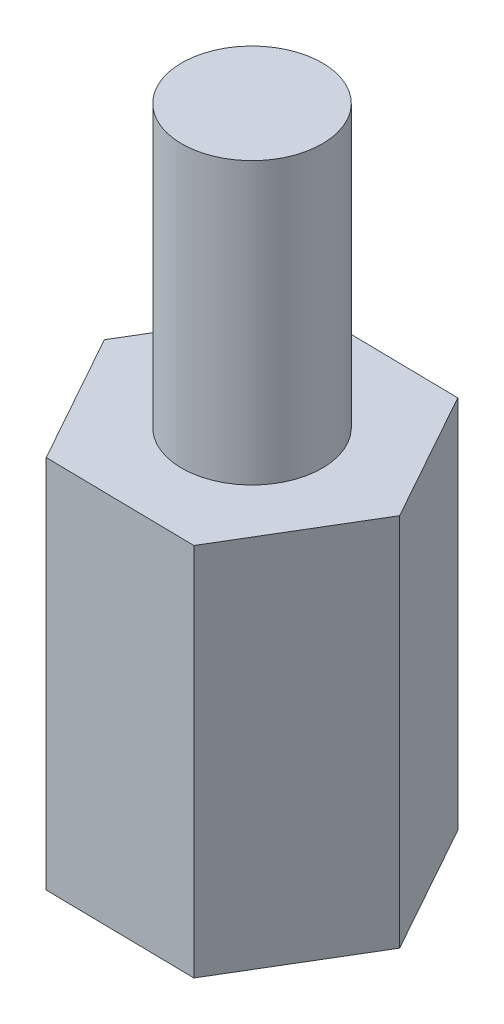
ISO-10303-21;
HEADER;
FILE_DESCRIPTION(('STEP AP214'),'2;1');
FILE_NAME('part.step','',(''),(''),'','','');
FILE_SCHEMA(('AUTOMOTIVE_DESIGN { 1 0 10303 214 1 1 1 1 }'));
ENDSEC;
DATA;
#1=APPLICATION_CONTEXT('core data for automotive mechanical design processes');
#2=APPLICATION_PROTOCOL_DEFINITION('international standard','automotive_design',2000,#1);
#3=PRODUCT_CONTEXT('',#1,'mechanical');
#4=PRODUCT('Part','Part','',(#3));
#5=PRODUCT_RELATED_PRODUCT_CATEGORY('part','',(#4));
#6=PRODUCT_DEFINITION_FORMATION('','',#4);
#7=PRODUCT_DEFINITION_CONTEXT('part definition',#1,'design');
#8=PRODUCT_DEFINITION('design','',#6,#7);
#9=PRODUCT_DEFINITION_SHAPE('','',#8);
#10=(LENGTH_UNIT() NAMED_UNIT(*) SI_UNIT(.MILLI.,.METRE.));
#11=(NAMED_UNIT(*) PLANE_ANGLE_UNIT() SI_UNIT($,.RADIAN.));
#12=(NAMED_UNIT(*) SI_UNIT($,.STERADIAN.) SOLID_ANGLE_UNIT());
#13=UNCERTAINTY_MEASURE_WITH_UNIT(LENGTH_MEASURE(1.E-05),#10,'distance_accuracy_value','');
#14=(GEOMETRIC_REPRESENTATION_CONTEXT(3) GLOBAL_UNCERTAINTY_ASSIGNED_CONTEXT((#13)) GLOBAL_UNIT_ASSIGNED_CONTEXT((#10,
#11,#12)) REPRESENTATION_CONTEXT('',''));
#15=CARTESIAN_POINT('',(0.,0.,0.));
#16=DIRECTION('',(0.,0.,1.));
#17=DIRECTION('',(1.,0.,0.));
#18=AXIS2_PLACEMENT_3D('',#15,#16,#17);
#19=CARTESIAN_POINT('',(-3.77710230661192,14.,-0.449026148338467));
#20=DIRECTION('',(0.,-1.,0.));
#21=DIRECTION('',(0.,0.,-1.));
#22=AXIS2_PLACEMENT_3D('',#19,#20,#21);
#23=CYLINDRICAL_SURFACE('',#22,1.5);
#24=CARTESIAN_POINT('',(-3.77710230661192,14.,-0.449026148338467));
#25=DIRECTION('',(0.,1.,0.));
#26=DIRECTION('',(0.,0.,1.));
#27=AXIS2_PLACEMENT_3D('',#24,#25,#26);
#28=CIRCLE('',#27,1.5);
#29=CARTESIAN_POINT('',(-3.77710230661192,14.,1.05097385166153));
#30=VERTEX_POINT('',#29);
#31=EDGE_CURVE('E11',#30,#30,#28,.T.);
#32=ORIENTED_EDGE('',*,*,#31,.F.);
#33=EDGE_LOOP('',(#32));
#34=FACE_BOUND('',#33,.T.);
#35=CARTESIAN_POINT('',(-3.77710230661192,8.,-0.449026148338467));
#36=DIRECTION('',(0.,1.,0.));
#37=DIRECTION('',(0.,0.,1.));
#38=AXIS2_PLACEMENT_3D('',#35,#36,#37);
#39=CIRCLE('',#38,1.5);
#40=CARTESIAN_POINT('',(-3.77710230661192,8.,1.05097385166153));
#41=VERTEX_POINT('',#40);
#42=EDGE_CURVE('E50',#41,#41,#39,.T.);
#43=ORIENTED_EDGE('',*,*,#42,.T.);
#44=EDGE_LOOP('',(#43));
#45=FACE_BOUND('',#44,.T.);
#46=ADVANCED_FACE('F47',(#34,#45),#23,.T.);
#47=CARTESIAN_POINT('',(-3.77710230661192,14.,-0.449026148338467));
#48=DIRECTION('',(0.,1.,0.));
#49=DIRECTION('',(0.,0.,1.));
#50=AXIS2_PLACEMENT_3D('',#47,#48,#49);
#51=PLANE('',#50);
#52=ORIENTED_EDGE('',*,*,#31,.T.);
#53=EDGE_LOOP('',(#52));
#54=FACE_BOUND('',#53,.T.);
#55=ADVANCED_FACE('F62',(#54),#51,.T.);
#56=CARTESIAN_POINT('',(-3.77710230661192,8.,-0.449026148338467));
#57=DIRECTION('',(0.,1.,0.));
#58=DIRECTION('',(0.,0.,1.));
#59=AXIS2_PLACEMENT_3D('',#56,#57,#58);
#60=PLANE('',#59);
#61=ORIENTED_EDGE('',*,*,#42,.F.);
#62=EDGE_LOOP('',(#61));
#63=FACE_BOUND('',#62,.T.);
#64=ADVANCED_FACE('F60',(#63),#60,.F.);
#65=CLOSED_SHELL('',(#46,#55,#64));
#66=MANIFOLD_SOLID_BREP('B2',#65);
#67=CARTESIAN_POINT('',(0.,8.,0.));
#68=DIRECTION('',(0.,1.,0.));
#69=DIRECTION('',(0.,0.,1.));
#70=AXIS2_PLACEMENT_3D('',#67,#68,#69);
#71=PLANE('',#70);
#72=DIRECTION('',(0.999876763326654,0.,0.0156989859358929));
#73=VECTOR('',#72,1.);
#74=CARTESIAN_POINT('',(-5.42261654631911,8.,2.30047978671984));
#75=LINE('',#74,#73);
#76=CARTESIAN_POINT('',(-5.42261654631911,8.,2.30047978671984));
#77=VERTEX_POINT('',#76);
#78=CARTESIAN_POINT('',(-2.21871743884893,8.,2.35078395306615));
#79=VERTEX_POINT('',#78);
#80=EDGE_CURVE('E195',#77,#79,#75,.T.);
#81=ORIENTED_EDGE('',*,*,#80,.T.);
#82=DIRECTION('',(0.513534102297464,0.,-0.858069184726697));
#83=VECTOR('',#82,1.);
#84=CARTESIAN_POINT('',(-2.21871743884893,8.,2.35078395306615));
#85=LINE('',#84,#83);
#86=CARTESIAN_POINT('',(-0.573203199141739,8.,-0.398721981992159));
#87=VERTEX_POINT('',#86);
#88=EDGE_CURVE('E143',#79,#87,#85,.T.);
#89=ORIENTED_EDGE('',*,*,#88,.T.);
#90=DIRECTION('',(-0.486342661029189,0.,-0.873768170662589));
#91=VECTOR('',#90,1.);
#92=CARTESIAN_POINT('',(-0.573203199141739,8.,-0.398721981992159));
#93=LINE('',#92,#91);
#94=CARTESIAN_POINT('',(-2.13158806690473,8.,-3.19853208339678));
#95=VERTEX_POINT('',#94);
#96=EDGE_CURVE('E156',#87,#95,#93,.T.);
#97=ORIENTED_EDGE('',*,*,#96,.T.);
#98=DIRECTION('',(-0.999876763326653,0.,-0.0156989859358926));
#99=VECTOR('',#98,1.);
#100=CARTESIAN_POINT('',(-2.13158806690473,8.,-3.19853208339678));
#101=LINE('',#100,#99);
#102=CARTESIAN_POINT('',(-5.3354871743749,8.,-3.24883624974309));
#103=VERTEX_POINT('',#102);
#104=EDGE_CURVE('E150',#95,#103,#101,.T.);
#105=ORIENTED_EDGE('',*,*,#104,.T.);
#106=DIRECTION('',(-0.513534102297464,0.,0.858069184726697));
#107=VECTOR('',#106,1.);
#108=CARTESIAN_POINT('',(-5.3354871743749,8.,-3.24883624974309));
#109=LINE('',#108,#107);
#110=CARTESIAN_POINT('',(-6.98100141408209,8.,-0.499330314684776));
#111=VERTEX_POINT('',#110);
#112=EDGE_CURVE('E154',#103,#111,#109,.T.);
#113=ORIENTED_EDGE('',*,*,#112,.T.);
#114=DIRECTION('',(0.486342661029189,0.,0.873768170662589));
#115=VECTOR('',#114,1.);
#116=CARTESIAN_POINT('',(-6.98100141408209,8.,-0.499330314684776));
#117=LINE('',#116,#115);
#118=EDGE_CURVE('E106',#111,#77,#117,.T.);
#119=ORIENTED_EDGE('',*,*,#118,.T.);
#120=EDGE_LOOP('',(#81,#89,#97,#105,#113,#119));
#121=FACE_BOUND('',#120,.T.);
#122=CARTESIAN_POINT('',(-3.77710230661192,8.,-0.449026148338467));
#123=DIRECTION('',(0.,1.,0.));
#124=DIRECTION('',(0.,0.,1.));
#125=AXIS2_PLACEMENT_3D('',#122,#123,#124);
#126=CIRCLE('',#125,1.5);
#127=CARTESIAN_POINT('',(-3.77710230661192,8.,1.05097385166153));
#128=VERTEX_POINT('',#127);
#129=EDGE_CURVE('E183',#128,#128,#126,.T.);
#130=ORIENTED_EDGE('',*,*,#129,.F.);
#131=EDGE_LOOP('',(#130));
#132=FACE_BOUND('',#131,.T.);
#133=ADVANCED_FACE('F88',(#121,#132),#71,.T.);
#134=CARTESIAN_POINT('',(0.,0.,0.));
#135=DIRECTION('',(0.,1.,0.));
#136=DIRECTION('',(0.,0.,1.));
#137=AXIS2_PLACEMENT_3D('',#134,#135,#136);
#138=PLANE('',#137);
#139=DIRECTION('',(0.999876763326654,0.,0.0156989859358929));
#140=VECTOR('',#139,1.);
#141=CARTESIAN_POINT('',(-5.42261654631911,0.,2.30047978671984));
#142=LINE('',#141,#140);
#143=CARTESIAN_POINT('',(-5.42261654631911,0.,2.30047978671984));
#144=VERTEX_POINT('',#143);
#145=CARTESIAN_POINT('',(-2.21871743884893,0.,2.35078395306615));
#146=VERTEX_POINT('',#145);
#147=EDGE_CURVE('E178',#144,#146,#142,.T.);
#148=ORIENTED_EDGE('',*,*,#147,.F.);
#149=DIRECTION('',(0.486342661029189,0.,0.873768170662589));
#150=VECTOR('',#149,1.);
#151=CARTESIAN_POINT('',(-6.98100141408209,0.,-0.499330314684776));
#152=LINE('',#151,#150);
#153=CARTESIAN_POINT('',(-6.98100141408209,0.,-0.499330314684776));
#154=VERTEX_POINT('',#153);
#155=EDGE_CURVE('E135',#154,#144,#152,.T.);
#156=ORIENTED_EDGE('',*,*,#155,.F.);
#157=DIRECTION('',(-0.513534102297464,0.,0.858069184726697));
#158=VECTOR('',#157,1.);
#159=CARTESIAN_POINT('',(-5.3354871743749,0.,-3.24883624974309));
#160=LINE('',#159,#158);
#161=CARTESIAN_POINT('',(-5.3354871743749,0.,-3.24883624974309));
#162=VERTEX_POINT('',#161);
#163=EDGE_CURVE('E129',#162,#154,#160,.T.);
#164=ORIENTED_EDGE('',*,*,#163,.F.);
#165=DIRECTION('',(-0.999876763326653,0.,-0.0156989859358926));
#166=VECTOR('',#165,1.);
#167=CARTESIAN_POINT('',(-2.13158806690473,0.,-3.19853208339678));
#168=LINE('',#167,#166);
#169=CARTESIAN_POINT('',(-2.13158806690473,0.,-3.19853208339678));
#170=VERTEX_POINT('',#169);
#171=EDGE_CURVE('E165',#170,#162,#168,.T.);
#172=ORIENTED_EDGE('',*,*,#171,.F.);
#173=DIRECTION('',(-0.486342661029189,0.,-0.873768170662589));
#174=VECTOR('',#173,1.);
#175=CARTESIAN_POINT('',(-0.573203199141739,0.,-0.398721981992159));
#176=LINE('',#175,#174);
#177=CARTESIAN_POINT('',(-0.573203199141739,0.,-0.398721981992159));
#178=VERTEX_POINT('',#177);
#179=EDGE_CURVE('E186',#178,#170,#176,.T.);
#180=ORIENTED_EDGE('',*,*,#179,.F.);
#181=DIRECTION('',(0.513534102297464,0.,-0.858069184726697));
#182=VECTOR('',#181,1.);
#183=CARTESIAN_POINT('',(-2.21871743884893,0.,2.35078395306615));
#184=LINE('',#183,#182);
#185=EDGE_CURVE('E182',#146,#178,#184,.T.);
#186=ORIENTED_EDGE('',*,*,#185,.F.);
#187=EDGE_LOOP('',(#148,#156,#164,#172,#180,#186));
#188=FACE_BOUND('',#187,.T.);
#189=CARTESIAN_POINT('',(-3.77710230661192,0.,-0.449026148338467));
#190=DIRECTION('',(0.,1.,0.));
#191=DIRECTION('',(0.,0.,1.));
#192=AXIS2_PLACEMENT_3D('',#189,#190,#191);
#193=CIRCLE('',#192,1.5);
#194=CARTESIAN_POINT('',(-3.77710230661192,0.,1.05097385166153));
#195=VERTEX_POINT('',#194);
#196=EDGE_CURVE('E292',#195,#195,#193,.T.);
#197=ORIENTED_EDGE('',*,*,#196,.T.);
#198=EDGE_LOOP('',(#197));
#199=FACE_BOUND('',#198,.T.);
#200=ADVANCED_FACE('F208',(#188,#199),#138,.F.);
#201=CARTESIAN_POINT('',(-5.42261654631911,8.,2.30047978671984));
#202=DIRECTION('',(0.0156989859358929,0.,-0.999876763326653));
#203=DIRECTION('',(-0.999876763326654,0.,-0.0156989859358929));
#204=AXIS2_PLACEMENT_3D('',#201,#202,#203);
#205=PLANE('',#204);
#206=ORIENTED_EDGE('',*,*,#147,.T.);
#207=DIRECTION('',(0.,-1.,0.));
#208=VECTOR('',#207,1.);
#209=CARTESIAN_POINT('',(-2.21871743884893,8.,2.35078395306615));
#210=LINE('',#209,#208);
#211=EDGE_CURVE('E45',#79,#146,#210,.T.);
#212=ORIENTED_EDGE('',*,*,#211,.F.);
#213=ORIENTED_EDGE('',*,*,#80,.F.);
#214=DIRECTION('',(0.,-1.,0.));
#215=VECTOR('',#214,1.);
#216=CARTESIAN_POINT('',(-5.42261654631911,8.,2.30047978671984));
#217=LINE('',#216,#215);
#218=EDGE_CURVE('E174',#77,#144,#217,.T.);
#219=ORIENTED_EDGE('',*,*,#218,.T.);
#220=EDGE_LOOP('',(#206,#212,#213,#219));
#221=FACE_BOUND('',#220,.T.);
#222=ADVANCED_FACE('F90',(#221),#205,.F.);
#223=CARTESIAN_POINT('',(-2.21871743884893,8.,2.35078395306615));
#224=DIRECTION('',(-0.858069184726697,0.,-0.513534102297464));
#225=DIRECTION('',(-0.513534102297464,0.,0.858069184726697));
#226=AXIS2_PLACEMENT_3D('',#223,#224,#225);
#227=PLANE('',#226);
#228=ORIENTED_EDGE('',*,*,#185,.T.);
#229=DIRECTION('',(0.,-1.,0.));
#230=VECTOR('',#229,1.);
#231=CARTESIAN_POINT('',(-0.573203199141739,8.,-0.398721981992159));
#232=LINE('',#231,#230);
#233=EDGE_CURVE('E98',#87,#178,#232,.T.);
#234=ORIENTED_EDGE('',*,*,#233,.F.);
#235=ORIENTED_EDGE('',*,*,#88,.F.);
#236=ORIENTED_EDGE('',*,*,#211,.T.);
#237=EDGE_LOOP('',(#228,#234,#235,#236));
#238=FACE_BOUND('',#237,.T.);
#239=ADVANCED_FACE('F233',(#238),#227,.F.);
#240=CARTESIAN_POINT('',(-0.573203199141739,8.,-0.398721981992159));
#241=DIRECTION('',(-0.873768170662589,0.,0.486342661029189));
#242=DIRECTION('',(0.486342661029189,0.,0.873768170662589));
#243=AXIS2_PLACEMENT_3D('',#240,#241,#242);
#244=PLANE('',#243);
#245=ORIENTED_EDGE('',*,*,#179,.T.);
#246=DIRECTION('',(0.,-1.,0.));
#247=VECTOR('',#246,1.);
#248=CARTESIAN_POINT('',(-2.13158806690473,8.,-3.19853208339678));
#249=LINE('',#248,#247);
#250=EDGE_CURVE('E167',#95,#170,#249,.T.);
#251=ORIENTED_EDGE('',*,*,#250,.F.);
#252=ORIENTED_EDGE('',*,*,#96,.F.);
#253=ORIENTED_EDGE('',*,*,#233,.T.);
#254=EDGE_LOOP('',(#245,#251,#252,#253));
#255=FACE_BOUND('',#254,.T.);
#256=ADVANCED_FACE('F205',(#255),#244,.F.);
#257=CARTESIAN_POINT('',(-2.13158806690473,8.,-3.19853208339678));
#258=DIRECTION('',(-0.0156989859358926,0.,0.999876763326653));
#259=DIRECTION('',(0.999876763326654,0.,0.0156989859358926));
#260=AXIS2_PLACEMENT_3D('',#257,#258,#259);
#261=PLANE('',#260);
#262=ORIENTED_EDGE('',*,*,#171,.T.);
#263=DIRECTION('',(0.,-1.,0.));
#264=VECTOR('',#263,1.);
#265=CARTESIAN_POINT('',(-5.3354871743749,8.,-3.24883624974309));
#266=LINE('',#265,#264);
#267=EDGE_CURVE('E162',#103,#162,#266,.T.);
#268=ORIENTED_EDGE('',*,*,#267,.F.);
#269=ORIENTED_EDGE('',*,*,#104,.F.);
#270=ORIENTED_EDGE('',*,*,#250,.T.);
#271=EDGE_LOOP('',(#262,#268,#269,#270));
#272=FACE_BOUND('',#271,.T.);
#273=ADVANCED_FACE('F163',(#272),#261,.F.);
#274=CARTESIAN_POINT('',(-5.3354871743749,8.,-3.24883624974309));
#275=DIRECTION('',(0.858069184726697,0.,0.513534102297464));
#276=DIRECTION('',(0.513534102297464,0.,-0.858069184726697));
#277=AXIS2_PLACEMENT_3D('',#274,#275,#276);
#278=PLANE('',#277);
#279=ORIENTED_EDGE('',*,*,#163,.T.);
#280=DIRECTION('',(0.,-1.,0.));
#281=VECTOR('',#280,1.);
#282=CARTESIAN_POINT('',(-6.98100141408209,8.,-0.499330314684776));
#283=LINE('',#282,#281);
#284=EDGE_CURVE('E168',#111,#154,#283,.T.);
#285=ORIENTED_EDGE('',*,*,#284,.F.);
#286=ORIENTED_EDGE('',*,*,#112,.F.);
#287=ORIENTED_EDGE('',*,*,#267,.T.);
#288=EDGE_LOOP('',(#279,#285,#286,#287));
#289=FACE_BOUND('',#288,.T.);
#290=ADVANCED_FACE('F170',(#289),#278,.F.);
#291=CARTESIAN_POINT('',(-6.98100141408209,8.,-0.499330314684776));
#292=DIRECTION('',(0.873768170662589,0.,-0.486342661029189));
#293=DIRECTION('',(-0.486342661029189,0.,-0.873768170662589));
#294=AXIS2_PLACEMENT_3D('',#291,#292,#293);
#295=PLANE('',#294);
#296=ORIENTED_EDGE('',*,*,#155,.T.);
#297=ORIENTED_EDGE('',*,*,#218,.F.);
#298=ORIENTED_EDGE('',*,*,#118,.F.);
#299=ORIENTED_EDGE('',*,*,#284,.T.);
#300=EDGE_LOOP('',(#296,#297,#298,#299));
#301=FACE_BOUND('',#300,.T.);
#302=ADVANCED_FACE('F213',(#301),#295,.F.);
#303=CARTESIAN_POINT('',(-3.77710230661192,8.,-0.449026148338467));
#304=DIRECTION('',(0.,-1.,0.));
#305=DIRECTION('',(0.,0.,-1.));
#306=AXIS2_PLACEMENT_3D('',#303,#304,#305);
#307=CYLINDRICAL_SURFACE('',#306,1.5);
#308=ORIENTED_EDGE('',*,*,#129,.T.);
#309=EDGE_LOOP('',(#308));
#310=FACE_BOUND('',#309,.T.);
#311=ORIENTED_EDGE('',*,*,#196,.F.);
#312=EDGE_LOOP('',(#311));
#313=FACE_BOUND('',#312,.T.);
#314=ADVANCED_FACE('F215',(#310,#313),#307,.F.);
#315=CLOSED_SHELL('',(#133,#200,#222,#239,#256,#273,#290,#302,#314));
#316=MANIFOLD_SOLID_BREP('B6',#315);
#317=ADVANCED_BREP_SHAPE_REPRESENTATION('',(#18,#66,#316),#14);
#318=SHAPE_DEFINITION_REPRESENTATION(#9,#317);
ENDSEC;
END-ISO-10303-21;
